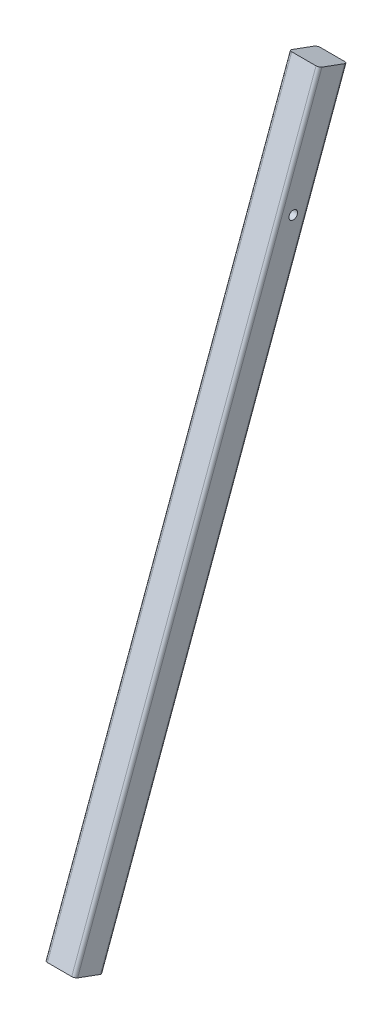
ISO-10303-21;
HEADER;
FILE_DESCRIPTION(('STEP AP214'),'2;1');
FILE_NAME('part.step','',(''),(''),'','','');
FILE_SCHEMA(('AUTOMOTIVE_DESIGN { 1 0 10303 214 1 1 1 1 }'));
ENDSEC;
DATA;
#1=APPLICATION_CONTEXT('core data for automotive mechanical design processes');
#2=APPLICATION_PROTOCOL_DEFINITION('international standard','automotive_design',2000,#1);
#3=PRODUCT_CONTEXT('',#1,'mechanical');
#4=PRODUCT('Part','Part','',(#3));
#5=PRODUCT_RELATED_PRODUCT_CATEGORY('part','',(#4));
#6=PRODUCT_DEFINITION_FORMATION('','',#4);
#7=PRODUCT_DEFINITION_CONTEXT('part definition',#1,'design');
#8=PRODUCT_DEFINITION('design','',#6,#7);
#9=PRODUCT_DEFINITION_SHAPE('','',#8);
#10=(LENGTH_UNIT() NAMED_UNIT(*) SI_UNIT(.MILLI.,.METRE.));
#11=(NAMED_UNIT(*) PLANE_ANGLE_UNIT() SI_UNIT($,.RADIAN.));
#12=(NAMED_UNIT(*) SI_UNIT($,.STERADIAN.) SOLID_ANGLE_UNIT());
#13=UNCERTAINTY_MEASURE_WITH_UNIT(LENGTH_MEASURE(1.E-05),#10,'distance_accuracy_value','');
#14=(GEOMETRIC_REPRESENTATION_CONTEXT(3) GLOBAL_UNCERTAINTY_ASSIGNED_CONTEXT((#13)) GLOBAL_UNIT_ASSIGNED_CONTEXT((#10,
#11,#12)) REPRESENTATION_CONTEXT('',''));
#15=CARTESIAN_POINT('',(0.,0.,0.));
#16=DIRECTION('',(0.,0.,1.));
#17=DIRECTION('',(1.,0.,0.));
#18=AXIS2_PLACEMENT_3D('',#15,#16,#17);
#19=CARTESIAN_POINT('',(-28.6909089695324,640.482845046119,1534.50446569532));
#20=DIRECTION('',(-1.,0.,0.));
#21=DIRECTION('',(0.,0.,1.));
#22=AXIS2_PLACEMENT_3D('',#19,#20,#21);
#23=PLANE('',#22);
#24=CARTESIAN_POINT('',(-28.6909089695324,537.667169913188,1588.16019182925));
#25=DIRECTION('',(1.,0.,0.));
#26=DIRECTION('',(0.,0.,-1.));
#27=AXIS2_PLACEMENT_3D('',#24,#25,#26);
#28=CIRCLE('',#27,4.25000000000109);
#29=CARTESIAN_POINT('',(-28.6909089695324,537.667169913188,1583.91019182925));
#30=VERTEX_POINT('',#29);
#31=EDGE_CURVE('E135',#30,#30,#28,.T.);
#32=ORIENTED_EDGE('',*,*,#31,.T.);
#33=EDGE_LOOP('',(#32));
#34=FACE_BOUND('',#33,.T.);
#35=DIRECTION('',(0.,0.344102109918843,0.938932232884461));
#36=VECTOR('',#35,1.);
#37=CARTESIAN_POINT('',(-28.6909089695324,-16.7697179730037,1775.37594263851));
#38=LINE('',#37,#36);
#39=CARTESIAN_POINT('',(-28.6909089695324,-15.7374116432468,1778.19273933716));
#40=VERTEX_POINT('',#39);
#41=CARTESIAN_POINT('',(-28.6909089695324,-7.47896100519614,1800.72711292638));
#42=VERTEX_POINT('',#41);
#43=EDGE_CURVE('E159',#40,#42,#38,.T.);
#44=ORIENTED_EDGE('',*,*,#43,.T.);
#45=DIRECTION('',(0.,-0.938932232884462,0.344102109918843));
#46=VECTOR('',#45,1.);
#47=CARTESIAN_POINT('',(-28.6909089695324,649.773602013927,1559.85563598319));
#48=LINE('',#47,#46);
#49=CARTESIAN_POINT('',(-28.6909089695324,649.773602013927,1559.85563598319));
#50=VERTEX_POINT('',#49);
#51=EDGE_CURVE('E109',#42,#50,#48,.F.);
#52=ORIENTED_EDGE('',*,*,#51,.T.);
#53=DIRECTION('',(0.,0.344102109918843,0.938932232884461));
#54=VECTOR('',#53,1.);
#55=CARTESIAN_POINT('',(-28.6909089695324,640.482845046119,1534.50446569532));
#56=LINE('',#55,#54);
#57=CARTESIAN_POINT('',(-28.6909089695324,641.515151375876,1537.32126239397));
#58=VERTEX_POINT('',#57);
#59=EDGE_CURVE('E148',#58,#50,#56,.T.);
#60=ORIENTED_EDGE('',*,*,#59,.F.);
#61=DIRECTION('',(0.,-0.938932232884462,0.344102109918843));
#62=VECTOR('',#61,1.);
#63=CARTESIAN_POINT('',(-28.6909089695324,-15.7374116432469,1778.19273933716));
#64=LINE('',#63,#62);
#65=EDGE_CURVE('E115',#58,#40,#64,.T.);
#66=ORIENTED_EDGE('',*,*,#65,.T.);
#67=EDGE_LOOP('',(#44,#52,#60,#66));
#68=FACE_BOUND('',#67,.T.);
#69=ADVANCED_FACE('F39',(#34,#68),#23,.T.);
#70=CARTESIAN_POINT('',(1.30909103046763,640.482845046119,1534.50446569532));
#71=DIRECTION('',(0.,0.938932232884461,-0.344102109918843));
#72=DIRECTION('',(0.,0.344102109918843,0.938932232884461));
#73=AXIS2_PLACEMENT_3D('',#70,#71,#72);
#74=PLANE('',#73);
#75=ORIENTED_EDGE('',*,*,#59,.T.);
#76=CARTESIAN_POINT('',(-25.6909089695318,649.773602013927,1559.85563598319));
#77=DIRECTION('',(0.,0.938932232884461,-0.344102109918843));
#78=DIRECTION('',(0.,0.344102109918843,0.938932232884461));
#79=AXIS2_PLACEMENT_3D('',#76,#77,#78);
#80=CIRCLE('',#79,3.00000000000058);
#81=CARTESIAN_POINT('',(-25.6909089695318,650.805908343683,1562.67243268185));
#82=VERTEX_POINT('',#81);
#83=EDGE_CURVE('E184',#50,#82,#80,.T.);
#84=ORIENTED_EDGE('',*,*,#83,.T.);
#85=DIRECTION('',(-1.,0.,0.));
#86=VECTOR('',#85,1.);
#87=CARTESIAN_POINT('',(1.30909103046763,650.805908343683,1562.67243268185));
#88=LINE('',#87,#86);
#89=CARTESIAN_POINT('',(-1.69090896953295,650.805908343683,1562.67243268185));
#90=VERTEX_POINT('',#89);
#91=EDGE_CURVE('E126',#90,#82,#88,.T.);
#92=ORIENTED_EDGE('',*,*,#91,.F.);
#93=CARTESIAN_POINT('',(-1.69090896953295,649.773602013927,1559.85563598319));
#94=DIRECTION('',(0.,0.938932232884461,-0.344102109918843));
#95=DIRECTION('',(0.,0.344102109918843,0.938932232884461));
#96=AXIS2_PLACEMENT_3D('',#93,#94,#95);
#97=CIRCLE('',#96,3.00000000000058);
#98=CARTESIAN_POINT('',(1.30909103046763,649.773602013927,1559.85563598319));
#99=VERTEX_POINT('',#98);
#100=EDGE_CURVE('E181',#90,#99,#97,.T.);
#101=ORIENTED_EDGE('',*,*,#100,.T.);
#102=DIRECTION('',(0.,0.344102109918843,0.938932232884461));
#103=VECTOR('',#102,1.);
#104=CARTESIAN_POINT('',(1.30909103046763,640.482845046119,1534.50446569532));
#105=LINE('',#104,#103);
#106=CARTESIAN_POINT('',(1.30909103046763,641.515151375876,1537.32126239397));
#107=VERTEX_POINT('',#106);
#108=EDGE_CURVE('E152',#107,#99,#105,.T.);
#109=ORIENTED_EDGE('',*,*,#108,.F.);
#110=CARTESIAN_POINT('',(-1.69090896953295,641.515151375876,1537.32126239397));
#111=DIRECTION('',(0.,0.938932232884461,-0.344102109918843));
#112=DIRECTION('',(0.,0.344102109918843,0.938932232884461));
#113=AXIS2_PLACEMENT_3D('',#110,#111,#112);
#114=CIRCLE('',#113,3.00000000000058);
#115=CARTESIAN_POINT('',(-1.69090896953295,640.482845046119,1534.50446569532));
#116=VERTEX_POINT('',#115);
#117=EDGE_CURVE('E60',#107,#116,#114,.T.);
#118=ORIENTED_EDGE('',*,*,#117,.T.);
#119=DIRECTION('',(-1.,0.,0.));
#120=VECTOR('',#119,1.);
#121=CARTESIAN_POINT('',(1.30909103046763,640.482845046119,1534.50446569532));
#122=LINE('',#121,#120);
#123=CARTESIAN_POINT('',(-25.6909089695318,640.482845046119,1534.50446569532));
#124=VERTEX_POINT('',#123);
#125=EDGE_CURVE('E145',#116,#124,#122,.T.);
#126=ORIENTED_EDGE('',*,*,#125,.T.);
#127=CARTESIAN_POINT('',(-25.6909089695318,641.515151375876,1537.32126239397));
#128=DIRECTION('',(0.,0.938932232884461,-0.344102109918843));
#129=DIRECTION('',(0.,0.344102109918843,0.938932232884461));
#130=AXIS2_PLACEMENT_3D('',#127,#128,#129);
#131=CIRCLE('',#130,3.00000000000058);
#132=EDGE_CURVE('E178',#124,#58,#131,.T.);
#133=ORIENTED_EDGE('',*,*,#132,.T.);
#134=EDGE_LOOP('',(#75,#84,#92,#101,#109,#118,#126,#133));
#135=FACE_BOUND('',#134,.T.);
#136=ADVANCED_FACE('F205',(#135),#74,.T.);
#137=CARTESIAN_POINT('',(1.30909103046771,-16.7697179730037,1775.37594263851));
#138=DIRECTION('',(1.,0.,0.));
#139=DIRECTION('',(0.,1.,0.));
#140=AXIS2_PLACEMENT_3D('',#137,#138,#139);
#141=PLANE('',#140);
#142=CARTESIAN_POINT('',(1.30909103046764,537.667169913188,1588.16019182925));
#143=DIRECTION('',(1.,0.,0.));
#144=DIRECTION('',(0.,0.,-1.));
#145=AXIS2_PLACEMENT_3D('',#142,#143,#144);
#146=CIRCLE('',#145,4.25000000000109);
#147=CARTESIAN_POINT('',(1.30909103046764,537.667169913188,1583.91019182925));
#148=VERTEX_POINT('',#147);
#149=EDGE_CURVE('E142',#148,#148,#146,.T.);
#150=ORIENTED_EDGE('',*,*,#149,.F.);
#151=EDGE_LOOP('',(#150));
#152=FACE_BOUND('',#151,.T.);
#153=ORIENTED_EDGE('',*,*,#108,.T.);
#154=DIRECTION('',(0.,0.938932232884462,-0.344102109918843));
#155=VECTOR('',#154,1.);
#156=CARTESIAN_POINT('',(1.30909103046771,-7.47896100519616,1800.72711292638));
#157=LINE('',#156,#155);
#158=CARTESIAN_POINT('',(1.30909103046771,-7.47896100519615,1800.72711292638));
#159=VERTEX_POINT('',#158);
#160=EDGE_CURVE('E191',#99,#159,#157,.F.);
#161=ORIENTED_EDGE('',*,*,#160,.T.);
#162=DIRECTION('',(0.,0.344102109918843,0.938932232884461));
#163=VECTOR('',#162,1.);
#164=CARTESIAN_POINT('',(1.30909103046771,-16.7697179730037,1775.37594263851));
#165=LINE('',#164,#163);
#166=CARTESIAN_POINT('',(1.30909103046771,-15.7374116432468,1778.19273933716));
#167=VERTEX_POINT('',#166);
#168=EDGE_CURVE('E156',#167,#159,#165,.T.);
#169=ORIENTED_EDGE('',*,*,#168,.F.);
#170=DIRECTION('',(0.,0.938932232884462,-0.344102109918843));
#171=VECTOR('',#170,1.);
#172=CARTESIAN_POINT('',(1.30909103046763,641.515151375877,1537.32126239397));
#173=LINE('',#172,#171);
#174=EDGE_CURVE('E187',#167,#107,#173,.T.);
#175=ORIENTED_EDGE('',*,*,#174,.T.);
#176=EDGE_LOOP('',(#153,#161,#169,#175));
#177=FACE_BOUND('',#176,.T.);
#178=ADVANCED_FACE('F203',(#152,#177),#141,.T.);
#179=CARTESIAN_POINT('',(-28.6909089695324,-16.7697179730037,1775.37594263851));
#180=DIRECTION('',(0.,-0.938932232884461,0.344102109918843));
#181=DIRECTION('',(0.,-0.344102109918843,-0.938932232884461));
#182=AXIS2_PLACEMENT_3D('',#179,#180,#181);
#183=PLANE('',#182);
#184=DIRECTION('',(1.,0.,0.));
#185=VECTOR('',#184,1.);
#186=CARTESIAN_POINT('',(-28.6909089695324,-6.4466546754397,1803.54390962504));
#187=LINE('',#186,#185);
#188=CARTESIAN_POINT('',(-25.6909089695318,-6.4466546754397,1803.54390962504));
#189=VERTEX_POINT('',#188);
#190=CARTESIAN_POINT('',(-1.69090896953287,-6.4466546754397,1803.54390962504));
#191=VERTEX_POINT('',#190);
#192=EDGE_CURVE('E123',#189,#191,#187,.T.);
#193=ORIENTED_EDGE('',*,*,#192,.F.);
#194=CARTESIAN_POINT('',(-25.6909089695318,-7.47896100519618,1800.72711292638));
#195=DIRECTION('',(0.,-0.938932232884461,0.344102109918843));
#196=DIRECTION('',(0.,-0.344102109918843,-0.938932232884461));
#197=AXIS2_PLACEMENT_3D('',#194,#195,#196);
#198=CIRCLE('',#197,3.00000000000058);
#199=EDGE_CURVE('E104',#189,#42,#198,.T.);
#200=ORIENTED_EDGE('',*,*,#199,.T.);
#201=ORIENTED_EDGE('',*,*,#43,.F.);
#202=CARTESIAN_POINT('',(-25.6909089695318,-15.7374116432468,1778.19273933716));
#203=DIRECTION('',(0.,-0.938932232884461,0.344102109918843));
#204=DIRECTION('',(0.,-0.344102109918843,-0.938932232884461));
#205=AXIS2_PLACEMENT_3D('',#202,#203,#204);
#206=CIRCLE('',#205,3.00000000000058);
#207=CARTESIAN_POINT('',(-25.6909089695318,-16.7697179730037,1775.37594263851));
#208=VERTEX_POINT('',#207);
#209=EDGE_CURVE('E166',#40,#208,#206,.T.);
#210=ORIENTED_EDGE('',*,*,#209,.T.);
#211=DIRECTION('',(1.,0.,0.));
#212=VECTOR('',#211,1.);
#213=CARTESIAN_POINT('',(-28.6909089695324,-16.7697179730037,1775.37594263851));
#214=LINE('',#213,#212);
#215=CARTESIAN_POINT('',(-1.69090896953287,-16.7697179730037,1775.37594263851));
#216=VERTEX_POINT('',#215);
#217=EDGE_CURVE('E139',#208,#216,#214,.T.);
#218=ORIENTED_EDGE('',*,*,#217,.T.);
#219=CARTESIAN_POINT('',(-1.69090896953287,-15.7374116432468,1778.19273933716));
#220=DIRECTION('',(0.,-0.938932232884461,0.344102109918843));
#221=DIRECTION('',(0.,-0.344102109918843,-0.938932232884461));
#222=AXIS2_PLACEMENT_3D('',#219,#220,#221);
#223=CIRCLE('',#222,3.00000000000058);
#224=EDGE_CURVE('E128',#216,#167,#223,.T.);
#225=ORIENTED_EDGE('',*,*,#224,.T.);
#226=ORIENTED_EDGE('',*,*,#168,.T.);
#227=CARTESIAN_POINT('',(-1.69090896953287,-7.47896100519618,1800.72711292638));
#228=DIRECTION('',(0.,-0.938932232884461,0.344102109918843));
#229=DIRECTION('',(0.,-0.344102109918843,-0.938932232884461));
#230=AXIS2_PLACEMENT_3D('',#227,#228,#229);
#231=CIRCLE('',#230,3.00000000000058);
#232=EDGE_CURVE('E116',#159,#191,#231,.T.);
#233=ORIENTED_EDGE('',*,*,#232,.T.);
#234=EDGE_LOOP('',(#193,#200,#201,#210,#218,#225,#226,#233));
#235=FACE_BOUND('',#234,.T.);
#236=ADVANCED_FACE('F131',(#235),#183,.T.);
#237=CARTESIAN_POINT('',(0.,571.618021417074,1559.74220946426));
#238=DIRECTION('',(0.,0.344102109918843,0.938932232884462));
#239=DIRECTION('',(0.,-0.938932232884462,0.344102109918843));
#240=AXIS2_PLACEMENT_3D('',#237,#238,#239);
#241=PLANE('',#240);
#242=ORIENTED_EDGE('',*,*,#217,.F.);
#243=DIRECTION('',(0.,-0.938932232884462,0.344102109918843));
#244=VECTOR('',#243,1.);
#245=CARTESIAN_POINT('',(-25.6909089695318,640.48284504612,1534.50446569532));
#246=LINE('',#245,#244);
#247=EDGE_CURVE('E11',#208,#124,#246,.F.);
#248=ORIENTED_EDGE('',*,*,#247,.T.);
#249=ORIENTED_EDGE('',*,*,#125,.F.);
#250=DIRECTION('',(0.,0.938932232884462,-0.344102109918843));
#251=VECTOR('',#250,1.);
#252=CARTESIAN_POINT('',(-1.69090896953287,-16.7697179730035,1775.37594263851));
#253=LINE('',#252,#251);
#254=EDGE_CURVE('E48',#116,#216,#253,.F.);
#255=ORIENTED_EDGE('',*,*,#254,.T.);
#256=EDGE_LOOP('',(#242,#248,#249,#255));
#257=FACE_BOUND('',#256,.T.);
#258=ADVANCED_FACE('F196',(#257),#241,.F.);
#259=CARTESIAN_POINT('',(0.,581.941084714638,1587.91017645079));
#260=DIRECTION('',(0.,0.344102109918843,0.938932232884462));
#261=DIRECTION('',(0.,-0.938932232884462,0.344102109918843));
#262=AXIS2_PLACEMENT_3D('',#259,#260,#261);
#263=PLANE('',#262);
#264=ORIENTED_EDGE('',*,*,#91,.T.);
#265=DIRECTION('',(0.,-0.938932232884462,0.344102109918843));
#266=VECTOR('',#265,1.);
#267=CARTESIAN_POINT('',(-25.6909089695318,581.941084714638,1587.91017645079));
#268=LINE('',#267,#266);
#269=EDGE_CURVE('E108',#82,#189,#268,.T.);
#270=ORIENTED_EDGE('',*,*,#269,.T.);
#271=ORIENTED_EDGE('',*,*,#192,.T.);
#272=DIRECTION('',(0.,0.938932232884462,-0.344102109918843));
#273=VECTOR('',#272,1.);
#274=CARTESIAN_POINT('',(-1.69090896953294,581.941084714638,1587.91017645079));
#275=LINE('',#274,#273);
#276=EDGE_CURVE('E129',#191,#90,#275,.T.);
#277=ORIENTED_EDGE('',*,*,#276,.T.);
#278=EDGE_LOOP('',(#264,#270,#271,#277));
#279=FACE_BOUND('',#278,.T.);
#280=ADVANCED_FACE('F121',(#279),#263,.T.);
#281=CARTESIAN_POINT('',(1.30909103046763,537.667169913188,1588.16019182925));
#282=DIRECTION('',(1.,0.,0.));
#283=DIRECTION('',(0.,0.,-1.));
#284=AXIS2_PLACEMENT_3D('',#281,#282,#283);
#285=CYLINDRICAL_SURFACE('',#284,4.25000000000109);
#286=ORIENTED_EDGE('',*,*,#31,.F.);
#287=EDGE_LOOP('',(#286));
#288=FACE_BOUND('',#287,.T.);
#289=ORIENTED_EDGE('',*,*,#149,.T.);
#290=EDGE_LOOP('',(#289));
#291=FACE_BOUND('',#290,.T.);
#292=ADVANCED_FACE('F216',(#288,#291),#285,.F.);
#293=CARTESIAN_POINT('',(-25.6909089695318,580.908778384881,1585.09337975214));
#294=DIRECTION('',(0.,-0.938932232884462,0.344102109918843));
#295=DIRECTION('',(0.,-0.344102109918843,-0.938932232884462));
#296=AXIS2_PLACEMENT_3D('',#293,#294,#295);
#297=CYLINDRICAL_SURFACE('',#296,3.00000000000058);
#298=ORIENTED_EDGE('',*,*,#83,.F.);
#299=ORIENTED_EDGE('',*,*,#51,.F.);
#300=ORIENTED_EDGE('',*,*,#199,.F.);
#301=ORIENTED_EDGE('',*,*,#269,.F.);
#302=EDGE_LOOP('',(#298,#299,#300,#301));
#303=FACE_BOUND('',#302,.T.);
#304=ADVANCED_FACE('F107',(#303),#297,.T.);
#305=CARTESIAN_POINT('',(-1.69090896953294,580.908778384881,1585.09337975214));
#306=DIRECTION('',(0.,0.938932232884462,-0.344102109918843));
#307=DIRECTION('',(0.,0.344102109918843,0.938932232884462));
#308=AXIS2_PLACEMENT_3D('',#305,#306,#307);
#309=CYLINDRICAL_SURFACE('',#308,3.00000000000058);
#310=ORIENTED_EDGE('',*,*,#232,.F.);
#311=ORIENTED_EDGE('',*,*,#160,.F.);
#312=ORIENTED_EDGE('',*,*,#100,.F.);
#313=ORIENTED_EDGE('',*,*,#276,.F.);
#314=EDGE_LOOP('',(#310,#311,#312,#313));
#315=FACE_BOUND('',#314,.T.);
#316=ADVANCED_FACE('F207',(#315),#309,.T.);
#317=CARTESIAN_POINT('',(-25.6909089695318,641.515151375876,1537.32126239397));
#318=DIRECTION('',(0.,0.938932232884462,-0.344102109918843));
#319=DIRECTION('',(0.,0.344102109918843,0.938932232884462));
#320=AXIS2_PLACEMENT_3D('',#317,#318,#319);
#321=CYLINDRICAL_SURFACE('',#320,3.00000000000058);
#322=ORIENTED_EDGE('',*,*,#132,.F.);
#323=ORIENTED_EDGE('',*,*,#247,.F.);
#324=ORIENTED_EDGE('',*,*,#209,.F.);
#325=ORIENTED_EDGE('',*,*,#65,.F.);
#326=EDGE_LOOP('',(#322,#323,#324,#325));
#327=FACE_BOUND('',#326,.T.);
#328=ADVANCED_FACE('F209',(#327),#321,.T.);
#329=CARTESIAN_POINT('',(-1.69090896953287,-15.7374116432468,1778.19273933716));
#330=DIRECTION('',(0.,-0.938932232884462,0.344102109918843));
#331=DIRECTION('',(0.,-0.344102109918843,-0.938932232884462));
#332=AXIS2_PLACEMENT_3D('',#329,#330,#331);
#333=CYLINDRICAL_SURFACE('',#332,3.00000000000058);
#334=ORIENTED_EDGE('',*,*,#224,.F.);
#335=ORIENTED_EDGE('',*,*,#254,.F.);
#336=ORIENTED_EDGE('',*,*,#117,.F.);
#337=ORIENTED_EDGE('',*,*,#174,.F.);
#338=EDGE_LOOP('',(#334,#335,#336,#337));
#339=FACE_BOUND('',#338,.T.);
#340=ADVANCED_FACE('F41',(#339),#333,.T.);
#341=CLOSED_SHELL('',(#69,#136,#178,#236,#258,#280,#292,#304,#316,#328,#340));
#342=MANIFOLD_SOLID_BREP('B2',#341);
#343=ADVANCED_BREP_SHAPE_REPRESENTATION('',(#18,#342),#14);
#344=SHAPE_DEFINITION_REPRESENTATION(#9,#343);
ENDSEC;
END-ISO-10303-21;
